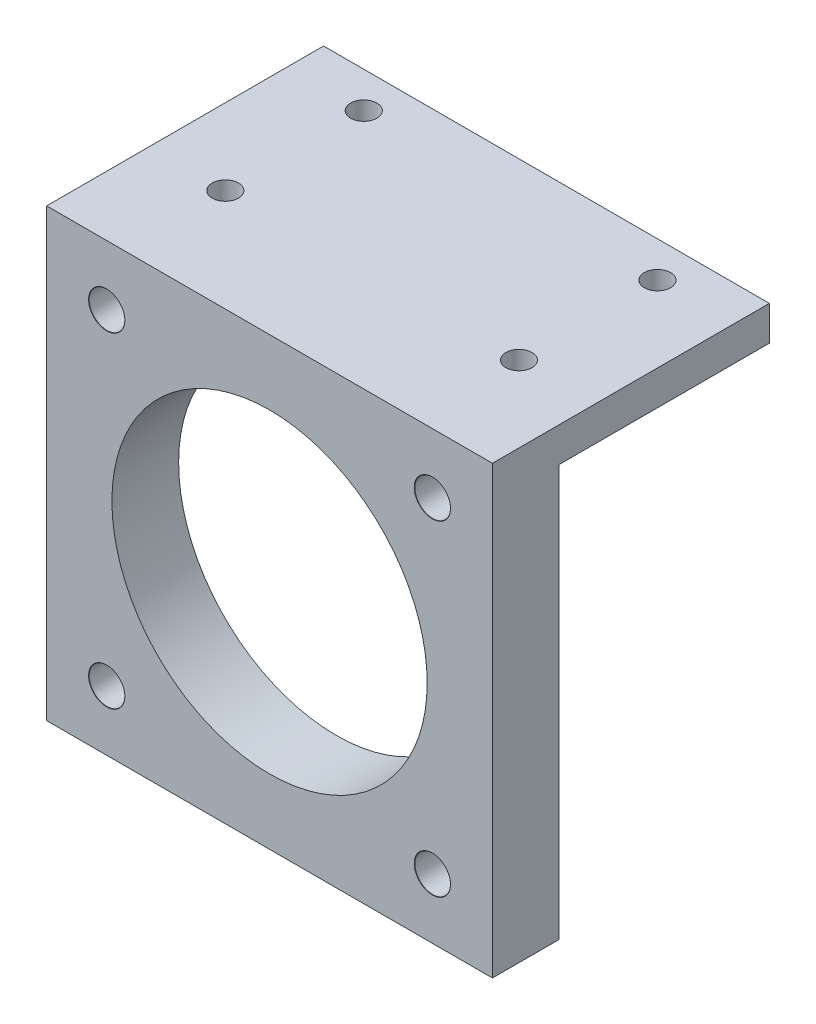
ISO-10303-21;
HEADER;
FILE_DESCRIPTION(('STEP AP214'),'2;1');
FILE_NAME('part.step','',(''),(''),'','','');
FILE_SCHEMA(('AUTOMOTIVE_DESIGN { 1 0 10303 214 1 1 1 1 }'));
ENDSEC;
DATA;
#1=APPLICATION_CONTEXT('core data for automotive mechanical design processes');
#2=APPLICATION_PROTOCOL_DEFINITION('international standard','automotive_design',2000,#1);
#3=PRODUCT_CONTEXT('',#1,'mechanical');
#4=PRODUCT('Part','Part','',(#3));
#5=PRODUCT_RELATED_PRODUCT_CATEGORY('part','',(#4));
#6=PRODUCT_DEFINITION_FORMATION('','',#4);
#7=PRODUCT_DEFINITION_CONTEXT('part definition',#1,'design');
#8=PRODUCT_DEFINITION('design','',#6,#7);
#9=PRODUCT_DEFINITION_SHAPE('','',#8);
#10=(LENGTH_UNIT() NAMED_UNIT(*) SI_UNIT(.MILLI.,.METRE.));
#11=(NAMED_UNIT(*) PLANE_ANGLE_UNIT() SI_UNIT($,.RADIAN.));
#12=(NAMED_UNIT(*) SI_UNIT($,.STERADIAN.) SOLID_ANGLE_UNIT());
#13=UNCERTAINTY_MEASURE_WITH_UNIT(LENGTH_MEASURE(1.E-05),#10,'distance_accuracy_value','');
#14=(GEOMETRIC_REPRESENTATION_CONTEXT(3) GLOBAL_UNCERTAINTY_ASSIGNED_CONTEXT((#13)) GLOBAL_UNIT_ASSIGNED_CONTEXT((#10,
#11,#12)) REPRESENTATION_CONTEXT('',''));
#15=CARTESIAN_POINT('',(0.,0.,0.));
#16=DIRECTION('',(0.,0.,1.));
#17=DIRECTION('',(1.,0.,0.));
#18=AXIS2_PLACEMENT_3D('',#15,#16,#17);
#19=CARTESIAN_POINT('',(0.,6.35,-10.));
#20=DIRECTION('',(0.,0.,-1.));
#21=DIRECTION('',(-1.,0.,0.));
#22=AXIS2_PLACEMENT_3D('',#19,#20,#21);
#23=PLANE('',#22);
#24=DIRECTION('',(0.,-1.,0.));
#25=VECTOR('',#24,1.);
#26=CARTESIAN_POINT('',(21.209,6.35,-10.));
#27=LINE('',#26,#25);
#28=CARTESIAN_POINT('',(21.209,6.35,-10.));
#29=VERTEX_POINT('',#28);
#30=CARTESIAN_POINT('',(21.209,3.06799999999997,-10.));
#31=VERTEX_POINT('',#30);
#32=EDGE_CURVE('E11',#29,#31,#27,.T.);
#33=ORIENTED_EDGE('',*,*,#32,.T.);
#34=DIRECTION('',(1.,0.,0.));
#35=VECTOR('',#34,1.);
#36=CARTESIAN_POINT('',(-21.209,3.06799999999997,-10.));
#37=LINE('',#36,#35);
#38=CARTESIAN_POINT('',(-21.209,3.06799999999997,-10.));
#39=VERTEX_POINT('',#38);
#40=EDGE_CURVE('E105',#39,#31,#37,.T.);
#41=ORIENTED_EDGE('',*,*,#40,.F.);
#42=DIRECTION('',(0.,-1.,0.));
#43=VECTOR('',#42,1.);
#44=CARTESIAN_POINT('',(-21.209,6.35,-10.));
#45=LINE('',#44,#43);
#46=CARTESIAN_POINT('',(-21.209,6.35,-10.));
#47=VERTEX_POINT('',#46);
#48=EDGE_CURVE('E54',#47,#39,#45,.T.);
#49=ORIENTED_EDGE('',*,*,#48,.F.);
#50=DIRECTION('',(1.,0.,0.));
#51=VECTOR('',#50,1.);
#52=CARTESIAN_POINT('',(0.,6.35,-10.));
#53=LINE('',#52,#51);
#54=EDGE_CURVE('E119',#47,#29,#53,.T.);
#55=ORIENTED_EDGE('',*,*,#54,.T.);
#56=EDGE_LOOP('',(#33,#41,#49,#55));
#57=FACE_BOUND('',#56,.T.);
#58=ADVANCED_FACE('F45',(#57),#23,.T.);
#59=CARTESIAN_POINT('',(-13.9706207064744,0.,6.58711900913497));
#60=DIRECTION('',(0.,-1.,0.));
#61=DIRECTION('',(0.,0.,-1.));
#62=AXIS2_PLACEMENT_3D('',#59,#60,#61);
#63=CYLINDRICAL_SURFACE('',#62,1.24999999999999);
#64=CARTESIAN_POINT('',(-13.9706207064744,6.35,6.58711900913497));
#65=DIRECTION('',(0.,1.,0.));
#66=DIRECTION('',(0.,0.,1.));
#67=AXIS2_PLACEMENT_3D('',#64,#65,#66);
#68=CIRCLE('',#67,1.24999999999999);
#69=CARTESIAN_POINT('',(-13.9706207064744,6.35,7.83711900913496));
#70=VERTEX_POINT('',#69);
#71=EDGE_CURVE('E123',#70,#70,#68,.T.);
#72=ORIENTED_EDGE('',*,*,#71,.T.);
#73=EDGE_LOOP('',(#72));
#74=FACE_BOUND('',#73,.T.);
#75=CARTESIAN_POINT('',(-13.9706207064744,3.06799999999997,6.58711900913497));
#76=DIRECTION('',(0.,-1.,0.));
#77=DIRECTION('',(0.,0.,-1.));
#78=AXIS2_PLACEMENT_3D('',#75,#76,#77);
#79=CIRCLE('',#78,1.24999999999999);
#80=CARTESIAN_POINT('',(-13.9706207064744,3.06799999999997,5.33711900913497));
#81=VERTEX_POINT('',#80);
#82=EDGE_CURVE('E157',#81,#81,#79,.F.);
#83=ORIENTED_EDGE('',*,*,#82,.F.);
#84=EDGE_LOOP('',(#83));
#85=FACE_BOUND('',#84,.T.);
#86=ADVANCED_FACE('F235',(#74,#85),#63,.F.);
#87=CARTESIAN_POINT('',(-13.9706207064743,0.,-6.58711900913496));
#88=DIRECTION('',(0.,-1.,0.));
#89=DIRECTION('',(0.,0.,-1.));
#90=AXIS2_PLACEMENT_3D('',#87,#88,#89);
#91=CYLINDRICAL_SURFACE('',#90,1.24999999999999);
#92=CARTESIAN_POINT('',(-13.9706207064743,6.35,-6.58711900913496));
#93=DIRECTION('',(0.,1.,0.));
#94=DIRECTION('',(0.,0.,1.));
#95=AXIS2_PLACEMENT_3D('',#92,#93,#94);
#96=CIRCLE('',#95,1.24999999999999);
#97=CARTESIAN_POINT('',(-13.9706207064743,6.35,-5.33711900913497));
#98=VERTEX_POINT('',#97);
#99=EDGE_CURVE('E126',#98,#98,#96,.T.);
#100=ORIENTED_EDGE('',*,*,#99,.T.);
#101=EDGE_LOOP('',(#100));
#102=FACE_BOUND('',#101,.T.);
#103=CARTESIAN_POINT('',(-13.9706207064743,3.06799999999997,-6.58711900913496));
#104=DIRECTION('',(0.,-1.,0.));
#105=DIRECTION('',(0.,0.,-1.));
#106=AXIS2_PLACEMENT_3D('',#103,#104,#105);
#107=CIRCLE('',#106,1.24999999999999);
#108=CARTESIAN_POINT('',(-13.9706207064743,3.06799999999997,-7.83711900913496));
#109=VERTEX_POINT('',#108);
#110=EDGE_CURVE('E150',#109,#109,#107,.F.);
#111=ORIENTED_EDGE('',*,*,#110,.F.);
#112=EDGE_LOOP('',(#111));
#113=FACE_BOUND('',#112,.T.);
#114=ADVANCED_FACE('F240',(#102,#113),#91,.F.);
#115=CARTESIAN_POINT('',(13.9706207064743,0.,6.58711900913497));
#116=DIRECTION('',(0.,-1.,0.));
#117=DIRECTION('',(0.,0.,-1.));
#118=AXIS2_PLACEMENT_3D('',#115,#116,#117);
#119=CYLINDRICAL_SURFACE('',#118,1.24999999999999);
#120=CARTESIAN_POINT('',(13.9706207064743,6.35,6.58711900913497));
#121=DIRECTION('',(0.,1.,0.));
#122=DIRECTION('',(0.,0.,1.));
#123=AXIS2_PLACEMENT_3D('',#120,#121,#122);
#124=CIRCLE('',#123,1.24999999999999);
#125=CARTESIAN_POINT('',(13.9706207064743,6.35,7.83711900913496));
#126=VERTEX_POINT('',#125);
#127=EDGE_CURVE('E129',#126,#126,#124,.T.);
#128=ORIENTED_EDGE('',*,*,#127,.T.);
#129=EDGE_LOOP('',(#128));
#130=FACE_BOUND('',#129,.T.);
#131=CARTESIAN_POINT('',(13.9706207064743,3.06799999999997,6.58711900913497));
#132=DIRECTION('',(0.,-1.,0.));
#133=DIRECTION('',(0.,0.,-1.));
#134=AXIS2_PLACEMENT_3D('',#131,#132,#133);
#135=CIRCLE('',#134,1.24999999999999);
#136=CARTESIAN_POINT('',(13.9706207064743,3.06799999999997,5.33711900913498));
#137=VERTEX_POINT('',#136);
#138=EDGE_CURVE('E147',#137,#137,#135,.F.);
#139=ORIENTED_EDGE('',*,*,#138,.F.);
#140=EDGE_LOOP('',(#139));
#141=FACE_BOUND('',#140,.T.);
#142=ADVANCED_FACE('F251',(#130,#141),#119,.F.);
#143=CARTESIAN_POINT('',(13.9706207064743,0.,-6.58711900913496));
#144=DIRECTION('',(0.,-1.,0.));
#145=DIRECTION('',(0.,0.,-1.));
#146=AXIS2_PLACEMENT_3D('',#143,#144,#145);
#147=CYLINDRICAL_SURFACE('',#146,1.24999999999999);
#148=CARTESIAN_POINT('',(13.9706207064743,6.35,-6.58711900913496));
#149=DIRECTION('',(0.,1.,0.));
#150=DIRECTION('',(0.,0.,1.));
#151=AXIS2_PLACEMENT_3D('',#148,#149,#150);
#152=CIRCLE('',#151,1.24999999999999);
#153=CARTESIAN_POINT('',(13.9706207064743,6.35,-5.33711900913497));
#154=VERTEX_POINT('',#153);
#155=EDGE_CURVE('E132',#154,#154,#152,.T.);
#156=ORIENTED_EDGE('',*,*,#155,.T.);
#157=EDGE_LOOP('',(#156));
#158=FACE_BOUND('',#157,.T.);
#159=CARTESIAN_POINT('',(13.9706207064743,3.06799999999997,-6.58711900913496));
#160=DIRECTION('',(0.,-1.,0.));
#161=DIRECTION('',(0.,0.,-1.));
#162=AXIS2_PLACEMENT_3D('',#159,#160,#161);
#163=CIRCLE('',#162,1.24999999999999);
#164=CARTESIAN_POINT('',(13.9706207064743,3.06799999999997,-7.83711900913496));
#165=VERTEX_POINT('',#164);
#166=EDGE_CURVE('E145',#165,#165,#163,.F.);
#167=ORIENTED_EDGE('',*,*,#166,.F.);
#168=EDGE_LOOP('',(#167));
#169=FACE_BOUND('',#168,.T.);
#170=ADVANCED_FACE('F255',(#158,#169),#147,.F.);
#171=CARTESIAN_POINT('',(21.209,6.35,0.));
#172=DIRECTION('',(-1.,0.,0.));
#173=DIRECTION('',(0.,0.,1.));
#174=AXIS2_PLACEMENT_3D('',#171,#172,#173);
#175=PLANE('',#174);
#176=DIRECTION('',(0.,1.,0.));
#177=VECTOR('',#176,1.);
#178=CARTESIAN_POINT('',(21.209,-36.068,10.));
#179=LINE('',#178,#177);
#180=CARTESIAN_POINT('',(21.209,-36.068,10.));
#181=VERTEX_POINT('',#180);
#182=CARTESIAN_POINT('',(21.209,3.06799999999997,10.));
#183=VERTEX_POINT('',#182);
#184=EDGE_CURVE('E197',#181,#183,#179,.T.);
#185=ORIENTED_EDGE('',*,*,#184,.T.);
#186=DIRECTION('',(0.,0.,1.));
#187=VECTOR('',#186,1.);
#188=CARTESIAN_POINT('',(21.209,3.06799999999997,10.));
#189=LINE('',#188,#187);
#190=EDGE_CURVE('E112',#31,#183,#189,.T.);
#191=ORIENTED_EDGE('',*,*,#190,.F.);
#192=ORIENTED_EDGE('',*,*,#32,.F.);
#193=DIRECTION('',(0.,0.,-1.));
#194=VECTOR('',#193,1.);
#195=CARTESIAN_POINT('',(21.209,6.35,0.));
#196=LINE('',#195,#194);
#197=CARTESIAN_POINT('',(21.209,6.35,16.35));
#198=VERTEX_POINT('',#197);
#199=EDGE_CURVE('E68',#198,#29,#196,.T.);
#200=ORIENTED_EDGE('',*,*,#199,.F.);
#201=DIRECTION('',(0.,1.,0.));
#202=VECTOR('',#201,1.);
#203=CARTESIAN_POINT('',(21.209,6.35,16.35));
#204=LINE('',#203,#202);
#205=CARTESIAN_POINT('',(21.209,-36.068,16.35));
#206=VERTEX_POINT('',#205);
#207=EDGE_CURVE('E203',#206,#198,#204,.T.);
#208=ORIENTED_EDGE('',*,*,#207,.F.);
#209=DIRECTION('',(0.,0.,1.));
#210=VECTOR('',#209,1.);
#211=CARTESIAN_POINT('',(21.209,-36.068,16.35));
#212=LINE('',#211,#210);
#213=EDGE_CURVE('E191',#181,#206,#212,.T.);
#214=ORIENTED_EDGE('',*,*,#213,.F.);
#215=EDGE_LOOP('',(#185,#191,#192,#200,#208,#214));
#216=FACE_BOUND('',#215,.T.);
#217=ADVANCED_FACE('F47',(#216),#175,.F.);
#218=CARTESIAN_POINT('',(-21.209,6.35,0.));
#219=DIRECTION('',(-1.,0.,0.));
#220=DIRECTION('',(0.,0.,1.));
#221=AXIS2_PLACEMENT_3D('',#218,#219,#220);
#222=PLANE('',#221);
#223=DIRECTION('',(0.,0.,-1.));
#224=VECTOR('',#223,1.);
#225=CARTESIAN_POINT('',(-21.209,3.06799999999997,10.));
#226=LINE('',#225,#224);
#227=CARTESIAN_POINT('',(-21.209,3.06799999999997,10.));
#228=VERTEX_POINT('',#227);
#229=EDGE_CURVE('E101',#228,#39,#226,.T.);
#230=ORIENTED_EDGE('',*,*,#229,.F.);
#231=DIRECTION('',(0.,1.,0.));
#232=VECTOR('',#231,1.);
#233=CARTESIAN_POINT('',(-21.209,-36.068,10.));
#234=LINE('',#233,#232);
#235=CARTESIAN_POINT('',(-21.209,-36.068,10.));
#236=VERTEX_POINT('',#235);
#237=EDGE_CURVE('E199',#236,#228,#234,.T.);
#238=ORIENTED_EDGE('',*,*,#237,.F.);
#239=DIRECTION('',(0.,0.,-1.));
#240=VECTOR('',#239,1.);
#241=CARTESIAN_POINT('',(-21.209,-36.068,16.35));
#242=LINE('',#241,#240);
#243=CARTESIAN_POINT('',(-21.209,-36.068,16.35));
#244=VERTEX_POINT('',#243);
#245=EDGE_CURVE('E139',#244,#236,#242,.T.);
#246=ORIENTED_EDGE('',*,*,#245,.F.);
#247=DIRECTION('',(0.,-1.,0.));
#248=VECTOR('',#247,1.);
#249=CARTESIAN_POINT('',(-21.209,6.35,16.35));
#250=LINE('',#249,#248);
#251=CARTESIAN_POINT('',(-21.209,6.35,16.35));
#252=VERTEX_POINT('',#251);
#253=EDGE_CURVE('E201',#252,#244,#250,.T.);
#254=ORIENTED_EDGE('',*,*,#253,.F.);
#255=DIRECTION('',(0.,0.,-1.));
#256=VECTOR('',#255,1.);
#257=CARTESIAN_POINT('',(-21.209,6.35,0.));
#258=LINE('',#257,#256);
#259=EDGE_CURVE('E117',#252,#47,#258,.T.);
#260=ORIENTED_EDGE('',*,*,#259,.T.);
#261=ORIENTED_EDGE('',*,*,#48,.T.);
#262=EDGE_LOOP('',(#230,#238,#246,#254,#260,#261));
#263=FACE_BOUND('',#262,.T.);
#264=ADVANCED_FACE('F115',(#263),#222,.T.);
#265=CARTESIAN_POINT('',(0.,6.35,0.));
#266=DIRECTION('',(0.,1.,0.));
#267=DIRECTION('',(0.,0.,1.));
#268=AXIS2_PLACEMENT_3D('',#265,#266,#267);
#269=PLANE('',#268);
#270=ORIENTED_EDGE('',*,*,#155,.F.);
#271=EDGE_LOOP('',(#270));
#272=FACE_BOUND('',#271,.T.);
#273=ORIENTED_EDGE('',*,*,#127,.F.);
#274=EDGE_LOOP('',(#273));
#275=FACE_BOUND('',#274,.T.);
#276=ORIENTED_EDGE('',*,*,#99,.F.);
#277=EDGE_LOOP('',(#276));
#278=FACE_BOUND('',#277,.T.);
#279=ORIENTED_EDGE('',*,*,#71,.F.);
#280=EDGE_LOOP('',(#279));
#281=FACE_BOUND('',#280,.T.);
#282=ORIENTED_EDGE('',*,*,#259,.F.);
#283=DIRECTION('',(-1.,0.,0.));
#284=VECTOR('',#283,1.);
#285=CARTESIAN_POINT('',(-21.209,6.35,16.35));
#286=LINE('',#285,#284);
#287=EDGE_CURVE('E135',#198,#252,#286,.T.);
#288=ORIENTED_EDGE('',*,*,#287,.F.);
#289=ORIENTED_EDGE('',*,*,#199,.T.);
#290=ORIENTED_EDGE('',*,*,#54,.F.);
#291=EDGE_LOOP('',(#282,#288,#289,#290));
#292=FACE_BOUND('',#291,.T.);
#293=ADVANCED_FACE('F208',(#272,#275,#278,#281,#292),#269,.T.);
#294=CARTESIAN_POINT('',(0.,0.,16.35));
#295=DIRECTION('',(0.,0.,1.));
#296=DIRECTION('',(1.,0.,0.));
#297=AXIS2_PLACEMENT_3D('',#294,#295,#296);
#298=PLANE('',#297);
#299=CARTESIAN_POINT('',(0.,-14.859,16.35));
#300=DIRECTION('',(0.,0.,1.));
#301=DIRECTION('',(1.,0.,0.));
#302=AXIS2_PLACEMENT_3D('',#299,#300,#301);
#303=CIRCLE('',#302,15.);
#304=CARTESIAN_POINT('',(15.,-14.859,16.35));
#305=VERTEX_POINT('',#304);
#306=EDGE_CURVE('E437',#305,#305,#303,.T.);
#307=ORIENTED_EDGE('',*,*,#306,.F.);
#308=EDGE_LOOP('',(#307));
#309=FACE_BOUND('',#308,.T.);
#310=CARTESIAN_POINT('',(-15.494,0.635000000000001,16.35));
#311=DIRECTION('',(0.,0.,1.));
#312=DIRECTION('',(1.,0.,0.));
#313=AXIS2_PLACEMENT_3D('',#310,#311,#312);
#314=CIRCLE('',#313,1.725);
#315=CARTESIAN_POINT('',(-13.769,0.635000000000001,16.35));
#316=VERTEX_POINT('',#315);
#317=EDGE_CURVE('E160',#316,#316,#314,.T.);
#318=ORIENTED_EDGE('',*,*,#317,.F.);
#319=EDGE_LOOP('',(#318));
#320=FACE_BOUND('',#319,.T.);
#321=CARTESIAN_POINT('',(15.494,0.635000000000001,16.35));
#322=DIRECTION('',(0.,0.,1.));
#323=DIRECTION('',(1.,0.,0.));
#324=AXIS2_PLACEMENT_3D('',#321,#322,#323);
#325=CIRCLE('',#324,1.725);
#326=CARTESIAN_POINT('',(17.219,0.635000000000001,16.35));
#327=VERTEX_POINT('',#326);
#328=EDGE_CURVE('E169',#327,#327,#325,.T.);
#329=ORIENTED_EDGE('',*,*,#328,.F.);
#330=EDGE_LOOP('',(#329));
#331=FACE_BOUND('',#330,.T.);
#332=CARTESIAN_POINT('',(15.494,-30.353,16.35));
#333=DIRECTION('',(0.,0.,1.));
#334=DIRECTION('',(1.,0.,0.));
#335=AXIS2_PLACEMENT_3D('',#332,#333,#334);
#336=CIRCLE('',#335,1.725);
#337=CARTESIAN_POINT('',(17.219,-30.353,16.35));
#338=VERTEX_POINT('',#337);
#339=EDGE_CURVE('E178',#338,#338,#336,.T.);
#340=ORIENTED_EDGE('',*,*,#339,.F.);
#341=EDGE_LOOP('',(#340));
#342=FACE_BOUND('',#341,.T.);
#343=CARTESIAN_POINT('',(-15.494,-30.353,16.35));
#344=DIRECTION('',(0.,0.,1.));
#345=DIRECTION('',(1.,0.,0.));
#346=AXIS2_PLACEMENT_3D('',#343,#344,#345);
#347=CIRCLE('',#346,1.725);
#348=CARTESIAN_POINT('',(-13.769,-30.353,16.35));
#349=VERTEX_POINT('',#348);
#350=EDGE_CURVE('E143',#349,#349,#347,.T.);
#351=ORIENTED_EDGE('',*,*,#350,.F.);
#352=EDGE_LOOP('',(#351));
#353=FACE_BOUND('',#352,.T.);
#354=ORIENTED_EDGE('',*,*,#253,.T.);
#355=DIRECTION('',(-1.,0.,0.));
#356=VECTOR('',#355,1.);
#357=CARTESIAN_POINT('',(-21.209,-36.068,16.35));
#358=LINE('',#357,#356);
#359=EDGE_CURVE('E194',#206,#244,#358,.T.);
#360=ORIENTED_EDGE('',*,*,#359,.F.);
#361=ORIENTED_EDGE('',*,*,#207,.T.);
#362=ORIENTED_EDGE('',*,*,#287,.T.);
#363=EDGE_LOOP('',(#354,#360,#361,#362));
#364=FACE_BOUND('',#363,.T.);
#365=ADVANCED_FACE('F210',(#309,#320,#331,#342,#353,#364),#298,.T.);
#366=CARTESIAN_POINT('',(-21.209,-36.068,10.));
#367=DIRECTION('',(0.,0.,1.));
#368=DIRECTION('',(1.,0.,0.));
#369=AXIS2_PLACEMENT_3D('',#366,#367,#368);
#370=PLANE('',#369);
#371=CARTESIAN_POINT('',(0.,-14.859,10.));
#372=DIRECTION('',(0.,0.,1.));
#373=DIRECTION('',(1.,0.,0.));
#374=AXIS2_PLACEMENT_3D('',#371,#372,#373);
#375=CIRCLE('',#374,15.);
#376=CARTESIAN_POINT('',(15.,-14.859,10.));
#377=VERTEX_POINT('',#376);
#378=EDGE_CURVE('E49',#377,#377,#375,.T.);
#379=ORIENTED_EDGE('',*,*,#378,.T.);
#380=EDGE_LOOP('',(#379));
#381=FACE_BOUND('',#380,.T.);
#382=CARTESIAN_POINT('',(-15.494,0.635000000000001,10.));
#383=DIRECTION('',(0.,0.,1.));
#384=DIRECTION('',(1.,0.,0.));
#385=AXIS2_PLACEMENT_3D('',#382,#383,#384);
#386=CIRCLE('',#385,1.7);
#387=CARTESIAN_POINT('',(-13.794,0.635000000000001,10.));
#388=VERTEX_POINT('',#387);
#389=EDGE_CURVE('E166',#388,#388,#386,.T.);
#390=ORIENTED_EDGE('',*,*,#389,.T.);
#391=EDGE_LOOP('',(#390));
#392=FACE_BOUND('',#391,.T.);
#393=CARTESIAN_POINT('',(15.494,0.635000000000001,10.));
#394=DIRECTION('',(0.,0.,1.));
#395=DIRECTION('',(1.,0.,0.));
#396=AXIS2_PLACEMENT_3D('',#393,#394,#395);
#397=CIRCLE('',#396,1.7);
#398=CARTESIAN_POINT('',(17.194,0.635000000000001,10.));
#399=VERTEX_POINT('',#398);
#400=EDGE_CURVE('E175',#399,#399,#397,.T.);
#401=ORIENTED_EDGE('',*,*,#400,.T.);
#402=EDGE_LOOP('',(#401));
#403=FACE_BOUND('',#402,.T.);
#404=CARTESIAN_POINT('',(15.494,-30.353,10.));
#405=DIRECTION('',(0.,0.,1.));
#406=DIRECTION('',(1.,0.,0.));
#407=AXIS2_PLACEMENT_3D('',#404,#405,#406);
#408=CIRCLE('',#407,1.7);
#409=CARTESIAN_POINT('',(17.194,-30.353,10.));
#410=VERTEX_POINT('',#409);
#411=EDGE_CURVE('E141',#410,#410,#408,.T.);
#412=ORIENTED_EDGE('',*,*,#411,.T.);
#413=EDGE_LOOP('',(#412));
#414=FACE_BOUND('',#413,.T.);
#415=CARTESIAN_POINT('',(-15.494,-30.353,10.));
#416=DIRECTION('',(0.,0.,1.));
#417=DIRECTION('',(1.,0.,0.));
#418=AXIS2_PLACEMENT_3D('',#415,#416,#417);
#419=CIRCLE('',#418,1.7);
#420=CARTESIAN_POINT('',(-13.794,-30.353,10.));
#421=VERTEX_POINT('',#420);
#422=EDGE_CURVE('E136',#421,#421,#419,.T.);
#423=ORIENTED_EDGE('',*,*,#422,.T.);
#424=EDGE_LOOP('',(#423));
#425=FACE_BOUND('',#424,.T.);
#426=ORIENTED_EDGE('',*,*,#237,.T.);
#427=DIRECTION('',(-1.,0.,0.));
#428=VECTOR('',#427,1.);
#429=CARTESIAN_POINT('',(-21.209,3.06799999999997,10.));
#430=LINE('',#429,#428);
#431=EDGE_CURVE('E108',#183,#228,#430,.T.);
#432=ORIENTED_EDGE('',*,*,#431,.F.);
#433=ORIENTED_EDGE('',*,*,#184,.F.);
#434=DIRECTION('',(1.,0.,0.));
#435=VECTOR('',#434,1.);
#436=CARTESIAN_POINT('',(-21.209,-36.068,10.));
#437=LINE('',#436,#435);
#438=EDGE_CURVE('E189',#236,#181,#437,.T.);
#439=ORIENTED_EDGE('',*,*,#438,.F.);
#440=EDGE_LOOP('',(#426,#432,#433,#439));
#441=FACE_BOUND('',#440,.T.);
#442=ADVANCED_FACE('F219',(#381,#392,#403,#414,#425,#441),#370,.F.);
#443=CARTESIAN_POINT('',(0.,-36.068,0.));
#444=DIRECTION('',(0.,-1.,0.));
#445=DIRECTION('',(0.,0.,-1.));
#446=AXIS2_PLACEMENT_3D('',#443,#444,#445);
#447=PLANE('',#446);
#448=ORIENTED_EDGE('',*,*,#245,.T.);
#449=ORIENTED_EDGE('',*,*,#438,.T.);
#450=ORIENTED_EDGE('',*,*,#213,.T.);
#451=ORIENTED_EDGE('',*,*,#359,.T.);
#452=EDGE_LOOP('',(#448,#449,#450,#451));
#453=FACE_BOUND('',#452,.T.);
#454=ADVANCED_FACE('F214',(#453),#447,.T.);
#455=CARTESIAN_POINT('',(-15.494,-30.353,16.35));
#456=DIRECTION('',(0.,0.,1.));
#457=DIRECTION('',(1.,0.,0.));
#458=AXIS2_PLACEMENT_3D('',#455,#456,#457);
#459=CYLINDRICAL_SURFACE('',#458,1.7);
#460=CARTESIAN_POINT('',(-15.494,-30.353,16.325));
#461=DIRECTION('',(0.,0.,1.));
#462=DIRECTION('',(1.,0.,0.));
#463=AXIS2_PLACEMENT_3D('',#460,#461,#462);
#464=CIRCLE('',#463,1.7);
#465=CARTESIAN_POINT('',(-13.794,-30.353,16.325));
#466=VERTEX_POINT('',#465);
#467=EDGE_CURVE('E140',#466,#466,#464,.T.);
#468=ORIENTED_EDGE('',*,*,#467,.T.);
#469=EDGE_LOOP('',(#468));
#470=FACE_BOUND('',#469,.T.);
#471=ORIENTED_EDGE('',*,*,#422,.F.);
#472=EDGE_LOOP('',(#471));
#473=FACE_BOUND('',#472,.T.);
#474=ADVANCED_FACE('F228',(#470,#473),#459,.F.);
#475=CARTESIAN_POINT('',(-15.494,-30.353,16.35));
#476=DIRECTION('',(0.,0.,1.));
#477=DIRECTION('',(1.,0.,0.));
#478=AXIS2_PLACEMENT_3D('',#475,#476,#477);
#479=CONICAL_SURFACE('',#478,1.725,0.785398163397448);
#480=ORIENTED_EDGE('',*,*,#467,.F.);
#481=EDGE_LOOP('',(#480));
#482=FACE_BOUND('',#481,.T.);
#483=ORIENTED_EDGE('',*,*,#350,.T.);
#484=EDGE_LOOP('',(#483));
#485=FACE_BOUND('',#484,.T.);
#486=ADVANCED_FACE('F303',(#482,#485),#479,.F.);
#487=CARTESIAN_POINT('',(15.494,-30.353,16.35));
#488=DIRECTION('',(0.,0.,1.));
#489=DIRECTION('',(1.,0.,0.));
#490=AXIS2_PLACEMENT_3D('',#487,#488,#489);
#491=CYLINDRICAL_SURFACE('',#490,1.7);
#492=CARTESIAN_POINT('',(15.494,-30.353,16.325));
#493=DIRECTION('',(0.,0.,1.));
#494=DIRECTION('',(1.,0.,0.));
#495=AXIS2_PLACEMENT_3D('',#492,#493,#494);
#496=CIRCLE('',#495,1.7);
#497=CARTESIAN_POINT('',(17.194,-30.353,16.325));
#498=VERTEX_POINT('',#497);
#499=EDGE_CURVE('E144',#498,#498,#496,.T.);
#500=ORIENTED_EDGE('',*,*,#499,.T.);
#501=EDGE_LOOP('',(#500));
#502=FACE_BOUND('',#501,.T.);
#503=ORIENTED_EDGE('',*,*,#411,.F.);
#504=EDGE_LOOP('',(#503));
#505=FACE_BOUND('',#504,.T.);
#506=ADVANCED_FACE('F299',(#502,#505),#491,.F.);
#507=CARTESIAN_POINT('',(15.494,-30.353,16.35));
#508=DIRECTION('',(0.,0.,1.));
#509=DIRECTION('',(1.,0.,0.));
#510=AXIS2_PLACEMENT_3D('',#507,#508,#509);
#511=CONICAL_SURFACE('',#510,1.725,0.785398163397448);
#512=ORIENTED_EDGE('',*,*,#499,.F.);
#513=EDGE_LOOP('',(#512));
#514=FACE_BOUND('',#513,.T.);
#515=ORIENTED_EDGE('',*,*,#339,.T.);
#516=EDGE_LOOP('',(#515));
#517=FACE_BOUND('',#516,.T.);
#518=ADVANCED_FACE('F295',(#514,#517),#511,.F.);
#519=CARTESIAN_POINT('',(15.494,0.635000000000001,16.35));
#520=DIRECTION('',(0.,0.,1.));
#521=DIRECTION('',(1.,0.,0.));
#522=AXIS2_PLACEMENT_3D('',#519,#520,#521);
#523=CYLINDRICAL_SURFACE('',#522,1.7);
#524=CARTESIAN_POINT('',(15.494,0.635000000000001,16.325));
#525=DIRECTION('',(0.,0.,1.));
#526=DIRECTION('',(1.,0.,0.));
#527=AXIS2_PLACEMENT_3D('',#524,#525,#526);
#528=CIRCLE('',#527,1.7);
#529=CARTESIAN_POINT('',(17.194,0.635000000000001,16.325));
#530=VERTEX_POINT('',#529);
#531=EDGE_CURVE('E172',#530,#530,#528,.T.);
#532=ORIENTED_EDGE('',*,*,#531,.T.);
#533=EDGE_LOOP('',(#532));
#534=FACE_BOUND('',#533,.T.);
#535=ORIENTED_EDGE('',*,*,#400,.F.);
#536=EDGE_LOOP('',(#535));
#537=FACE_BOUND('',#536,.T.);
#538=ADVANCED_FACE('F291',(#534,#537),#523,.F.);
#539=CARTESIAN_POINT('',(15.494,0.635000000000001,16.35));
#540=DIRECTION('',(0.,0.,1.));
#541=DIRECTION('',(1.,0.,0.));
#542=AXIS2_PLACEMENT_3D('',#539,#540,#541);
#543=CONICAL_SURFACE('',#542,1.725,0.785398163397448);
#544=ORIENTED_EDGE('',*,*,#531,.F.);
#545=EDGE_LOOP('',(#544));
#546=FACE_BOUND('',#545,.T.);
#547=ORIENTED_EDGE('',*,*,#328,.T.);
#548=EDGE_LOOP('',(#547));
#549=FACE_BOUND('',#548,.T.);
#550=ADVANCED_FACE('F287',(#546,#549),#543,.F.);
#551=CARTESIAN_POINT('',(-15.494,0.635000000000001,16.35));
#552=DIRECTION('',(0.,0.,1.));
#553=DIRECTION('',(1.,0.,0.));
#554=AXIS2_PLACEMENT_3D('',#551,#552,#553);
#555=CYLINDRICAL_SURFACE('',#554,1.7);
#556=CARTESIAN_POINT('',(-15.494,0.635000000000001,16.325));
#557=DIRECTION('',(0.,0.,1.));
#558=DIRECTION('',(1.,0.,0.));
#559=AXIS2_PLACEMENT_3D('',#556,#557,#558);
#560=CIRCLE('',#559,1.7);
#561=CARTESIAN_POINT('',(-13.794,0.635000000000001,16.325));
#562=VERTEX_POINT('',#561);
#563=EDGE_CURVE('E163',#562,#562,#560,.T.);
#564=ORIENTED_EDGE('',*,*,#563,.T.);
#565=EDGE_LOOP('',(#564));
#566=FACE_BOUND('',#565,.T.);
#567=ORIENTED_EDGE('',*,*,#389,.F.);
#568=EDGE_LOOP('',(#567));
#569=FACE_BOUND('',#568,.T.);
#570=ADVANCED_FACE('F282',(#566,#569),#555,.F.);
#571=CARTESIAN_POINT('',(-15.494,0.635000000000001,16.35));
#572=DIRECTION('',(0.,0.,1.));
#573=DIRECTION('',(1.,0.,0.));
#574=AXIS2_PLACEMENT_3D('',#571,#572,#573);
#575=CONICAL_SURFACE('',#574,1.725,0.785398163397414);
#576=ORIENTED_EDGE('',*,*,#563,.F.);
#577=EDGE_LOOP('',(#576));
#578=FACE_BOUND('',#577,.T.);
#579=ORIENTED_EDGE('',*,*,#317,.T.);
#580=EDGE_LOOP('',(#579));
#581=FACE_BOUND('',#580,.T.);
#582=ADVANCED_FACE('F275',(#578,#581),#575,.F.);
#583=CARTESIAN_POINT('',(0.,3.06799999999997,0.));
#584=DIRECTION('',(0.,-1.,0.));
#585=DIRECTION('',(0.,0.,-1.));
#586=AXIS2_PLACEMENT_3D('',#583,#584,#585);
#587=PLANE('',#586);
#588=ORIENTED_EDGE('',*,*,#229,.T.);
#589=ORIENTED_EDGE('',*,*,#40,.T.);
#590=ORIENTED_EDGE('',*,*,#190,.T.);
#591=ORIENTED_EDGE('',*,*,#431,.T.);
#592=EDGE_LOOP('',(#588,#589,#590,#591));
#593=FACE_BOUND('',#592,.T.);
#594=ORIENTED_EDGE('',*,*,#166,.T.);
#595=EDGE_LOOP('',(#594));
#596=FACE_BOUND('',#595,.T.);
#597=ORIENTED_EDGE('',*,*,#138,.T.);
#598=EDGE_LOOP('',(#597));
#599=FACE_BOUND('',#598,.T.);
#600=ORIENTED_EDGE('',*,*,#110,.T.);
#601=EDGE_LOOP('',(#600));
#602=FACE_BOUND('',#601,.T.);
#603=ORIENTED_EDGE('',*,*,#82,.T.);
#604=EDGE_LOOP('',(#603));
#605=FACE_BOUND('',#604,.T.);
#606=ADVANCED_FACE('F102',(#593,#596,#599,#602,#605),#587,.T.);
#607=CARTESIAN_POINT('',(0.,-14.859,-10.));
#608=DIRECTION('',(0.,0.,1.));
#609=DIRECTION('',(1.,0.,0.));
#610=AXIS2_PLACEMENT_3D('',#607,#608,#609);
#611=CYLINDRICAL_SURFACE('',#610,15.);
#612=ORIENTED_EDGE('',*,*,#306,.T.);
#613=EDGE_LOOP('',(#612));
#614=FACE_BOUND('',#613,.T.);
#615=ORIENTED_EDGE('',*,*,#378,.F.);
#616=EDGE_LOOP('',(#615));
#617=FACE_BOUND('',#616,.T.);
#618=ADVANCED_FACE('F274',(#614,#617),#611,.F.);
#619=CLOSED_SHELL('',(#58,#86,#114,#142,#170,#217,#264,#293,#365,#442,#454,#474,#486,#506,#518,
#538,#550,#570,#582,#606,#618));
#620=MANIFOLD_SOLID_BREP('B2',#619);
#621=ADVANCED_BREP_SHAPE_REPRESENTATION('',(#18,#620),#14);
#622=SHAPE_DEFINITION_REPRESENTATION(#9,#621);
ENDSEC;
END-ISO-10303-21;
